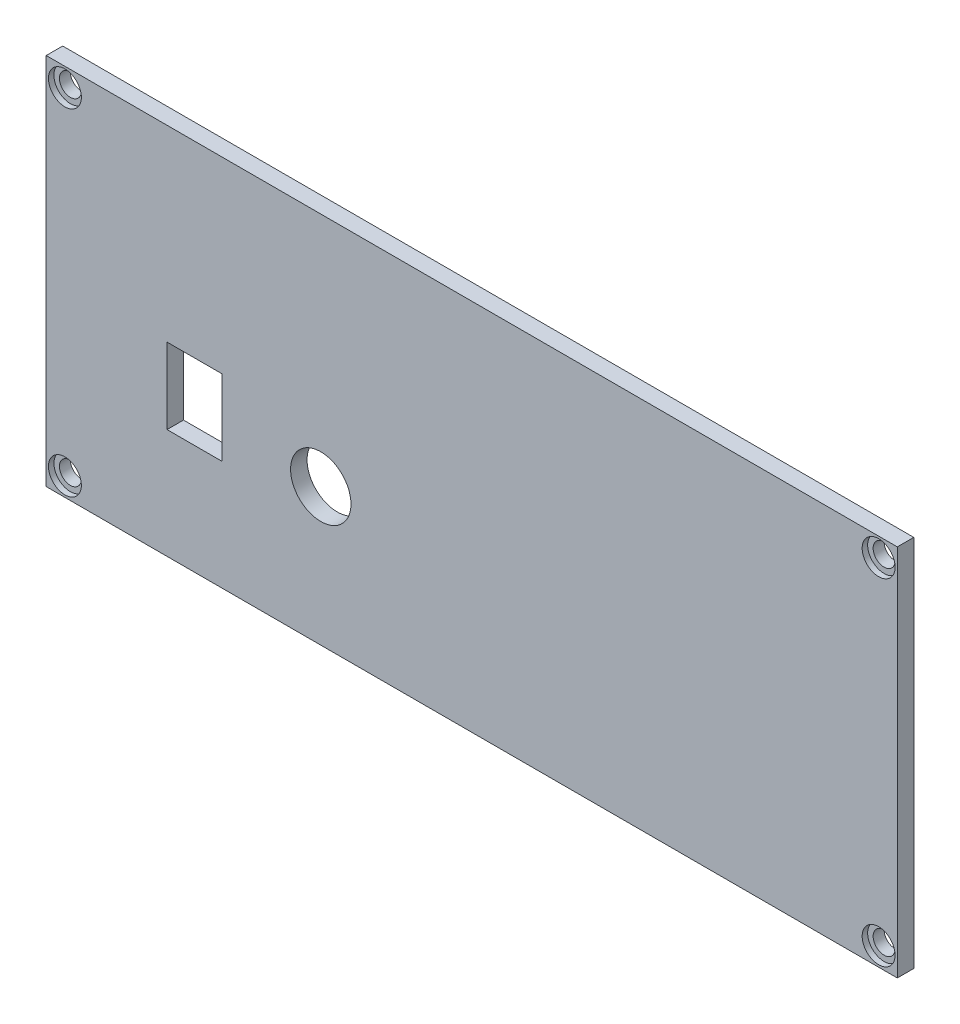
ISO-10303-21;
HEADER;
FILE_DESCRIPTION(('STEP AP214'),'2;1');
FILE_NAME('part.step','',(''),(''),'','','');
FILE_SCHEMA(('AUTOMOTIVE_DESIGN { 1 0 10303 214 1 1 1 1 }'));
ENDSEC;
DATA;
#1=APPLICATION_CONTEXT('core data for automotive mechanical design processes');
#2=APPLICATION_PROTOCOL_DEFINITION('international standard','automotive_design',2000,#1);
#3=PRODUCT_CONTEXT('',#1,'mechanical');
#4=PRODUCT('Part','Part','',(#3));
#5=PRODUCT_RELATED_PRODUCT_CATEGORY('part','',(#4));
#6=PRODUCT_DEFINITION_FORMATION('','',#4);
#7=PRODUCT_DEFINITION_CONTEXT('part definition',#1,'design');
#8=PRODUCT_DEFINITION('design','',#6,#7);
#9=PRODUCT_DEFINITION_SHAPE('','',#8);
#10=(LENGTH_UNIT() NAMED_UNIT(*) SI_UNIT(.MILLI.,.METRE.));
#11=(NAMED_UNIT(*) PLANE_ANGLE_UNIT() SI_UNIT($,.RADIAN.));
#12=(NAMED_UNIT(*) SI_UNIT($,.STERADIAN.) SOLID_ANGLE_UNIT());
#13=UNCERTAINTY_MEASURE_WITH_UNIT(LENGTH_MEASURE(1.E-05),#10,'distance_accuracy_value','');
#14=(GEOMETRIC_REPRESENTATION_CONTEXT(3) GLOBAL_UNCERTAINTY_ASSIGNED_CONTEXT((#13)) GLOBAL_UNIT_ASSIGNED_CONTEXT((#10,
#11,#12)) REPRESENTATION_CONTEXT('',''));
#15=CARTESIAN_POINT('',(0.,0.,0.));
#16=DIRECTION('',(0.,0.,1.));
#17=DIRECTION('',(1.,0.,0.));
#18=AXIS2_PLACEMENT_3D('',#15,#16,#17);
#19=CARTESIAN_POINT('',(-3.39999999999998,3.4,0.));
#20=DIRECTION('',(0.,0.,1.));
#21=DIRECTION('',(1.,0.,0.));
#22=AXIS2_PLACEMENT_3D('',#19,#20,#21);
#23=CYLINDRICAL_SURFACE('',#22,2.);
#24=CARTESIAN_POINT('',(-3.39999999999998,3.4,0.));
#25=DIRECTION('',(0.,0.,1.));
#26=DIRECTION('',(1.,0.,0.));
#27=AXIS2_PLACEMENT_3D('',#24,#25,#26);
#28=CIRCLE('',#27,2.);
#29=CARTESIAN_POINT('',(-1.39999999999998,3.4,0.));
#30=VERTEX_POINT('',#29);
#31=EDGE_CURVE('E169',#30,#30,#28,.T.);
#32=ORIENTED_EDGE('',*,*,#31,.F.);
#33=EDGE_LOOP('',(#32));
#34=FACE_BOUND('',#33,.T.);
#35=CARTESIAN_POINT('',(-3.39999999999998,3.4,2.));
#36=DIRECTION('',(0.,0.,1.));
#37=DIRECTION('',(1.,0.,0.));
#38=AXIS2_PLACEMENT_3D('',#35,#36,#37);
#39=CIRCLE('',#38,2.);
#40=CARTESIAN_POINT('',(-1.39999999999998,3.4,2.));
#41=VERTEX_POINT('',#40);
#42=EDGE_CURVE('E37',#41,#41,#39,.F.);
#43=ORIENTED_EDGE('',*,*,#42,.F.);
#44=EDGE_LOOP('',(#43));
#45=FACE_BOUND('',#44,.T.);
#46=ADVANCED_FACE('F33',(#34,#45),#23,.F.);
#47=CARTESIAN_POINT('',(-151.6,64.6,0.));
#48=DIRECTION('',(0.,0.,1.));
#49=DIRECTION('',(1.,0.,0.));
#50=AXIS2_PLACEMENT_3D('',#47,#48,#49);
#51=CYLINDRICAL_SURFACE('',#50,2.);
#52=CARTESIAN_POINT('',(-151.6,64.6,0.));
#53=DIRECTION('',(0.,0.,1.));
#54=DIRECTION('',(1.,0.,0.));
#55=AXIS2_PLACEMENT_3D('',#52,#53,#54);
#56=CIRCLE('',#55,2.);
#57=CARTESIAN_POINT('',(-149.6,64.6,0.));
#58=VERTEX_POINT('',#57);
#59=EDGE_CURVE('E193',#58,#58,#56,.T.);
#60=ORIENTED_EDGE('',*,*,#59,.F.);
#61=EDGE_LOOP('',(#60));
#62=FACE_BOUND('',#61,.T.);
#63=CARTESIAN_POINT('',(-151.6,64.6,2.));
#64=DIRECTION('',(0.,0.,1.));
#65=DIRECTION('',(1.,0.,0.));
#66=AXIS2_PLACEMENT_3D('',#63,#64,#65);
#67=CIRCLE('',#66,2.);
#68=CARTESIAN_POINT('',(-149.6,64.6,2.));
#69=VERTEX_POINT('',#68);
#70=EDGE_CURVE('E166',#69,#69,#67,.F.);
#71=ORIENTED_EDGE('',*,*,#70,.F.);
#72=EDGE_LOOP('',(#71));
#73=FACE_BOUND('',#72,.T.);
#74=ADVANCED_FACE('F243',(#62,#73),#51,.F.);
#75=CARTESIAN_POINT('',(0.,0.,3.));
#76=DIRECTION('',(-1.,0.,0.));
#77=DIRECTION('',(0.,-1.,0.));
#78=AXIS2_PLACEMENT_3D('',#75,#76,#77);
#79=PLANE('',#78);
#80=DIRECTION('',(0.,1.,0.));
#81=VECTOR('',#80,1.);
#82=CARTESIAN_POINT('',(0.,0.,0.));
#83=LINE('',#82,#81);
#84=CARTESIAN_POINT('',(0.,0.,0.));
#85=VERTEX_POINT('',#84);
#86=CARTESIAN_POINT('',(0.,68.,0.));
#87=VERTEX_POINT('',#86);
#88=EDGE_CURVE('E137',#85,#87,#83,.T.);
#89=ORIENTED_EDGE('',*,*,#88,.T.);
#90=DIRECTION('',(0.,0.,-1.));
#91=VECTOR('',#90,1.);
#92=CARTESIAN_POINT('',(0.,68.,3.));
#93=LINE('',#92,#91);
#94=CARTESIAN_POINT('',(0.,68.,3.));
#95=VERTEX_POINT('',#94);
#96=EDGE_CURVE('E11',#95,#87,#93,.T.);
#97=ORIENTED_EDGE('',*,*,#96,.F.);
#98=DIRECTION('',(0.,1.,0.));
#99=VECTOR('',#98,1.);
#100=CARTESIAN_POINT('',(0.,0.,3.));
#101=LINE('',#100,#99);
#102=CARTESIAN_POINT('',(0.,0.,3.));
#103=VERTEX_POINT('',#102);
#104=EDGE_CURVE('E141',#103,#95,#101,.T.);
#105=ORIENTED_EDGE('',*,*,#104,.F.);
#106=DIRECTION('',(0.,0.,-1.));
#107=VECTOR('',#106,1.);
#108=CARTESIAN_POINT('',(0.,0.,3.));
#109=LINE('',#108,#107);
#110=EDGE_CURVE('E151',#103,#85,#109,.T.);
#111=ORIENTED_EDGE('',*,*,#110,.T.);
#112=EDGE_LOOP('',(#89,#97,#105,#111));
#113=FACE_BOUND('',#112,.T.);
#114=ADVANCED_FACE('F35',(#113),#79,.F.);
#115=CARTESIAN_POINT('',(0.,68.,3.));
#116=DIRECTION('',(0.,-1.,0.));
#117=DIRECTION('',(1.,0.,0.));
#118=AXIS2_PLACEMENT_3D('',#115,#116,#117);
#119=PLANE('',#118);
#120=DIRECTION('',(-1.,0.,0.));
#121=VECTOR('',#120,1.);
#122=CARTESIAN_POINT('',(0.,68.,0.));
#123=LINE('',#122,#121);
#124=CARTESIAN_POINT('',(-155.,68.,0.));
#125=VERTEX_POINT('',#124);
#126=EDGE_CURVE('E154',#87,#125,#123,.T.);
#127=ORIENTED_EDGE('',*,*,#126,.T.);
#128=DIRECTION('',(0.,0.,-1.));
#129=VECTOR('',#128,1.);
#130=CARTESIAN_POINT('',(-155.,68.,3.));
#131=LINE('',#130,#129);
#132=CARTESIAN_POINT('',(-155.,68.,3.));
#133=VERTEX_POINT('',#132);
#134=EDGE_CURVE('E42',#133,#125,#131,.T.);
#135=ORIENTED_EDGE('',*,*,#134,.F.);
#136=DIRECTION('',(-1.,0.,0.));
#137=VECTOR('',#136,1.);
#138=CARTESIAN_POINT('',(0.,68.,3.));
#139=LINE('',#138,#137);
#140=EDGE_CURVE('E144',#95,#133,#139,.T.);
#141=ORIENTED_EDGE('',*,*,#140,.F.);
#142=ORIENTED_EDGE('',*,*,#96,.T.);
#143=EDGE_LOOP('',(#127,#135,#141,#142));
#144=FACE_BOUND('',#143,.T.);
#145=ADVANCED_FACE('F224',(#144),#119,.F.);
#146=CARTESIAN_POINT('',(-155.,0.,3.));
#147=DIRECTION('',(1.,0.,0.));
#148=DIRECTION('',(0.,0.,-1.));
#149=AXIS2_PLACEMENT_3D('',#146,#147,#148);
#150=PLANE('',#149);
#151=DIRECTION('',(0.,-1.,0.));
#152=VECTOR('',#151,1.);
#153=CARTESIAN_POINT('',(-155.,0.,0.));
#154=LINE('',#153,#152);
#155=CARTESIAN_POINT('',(-155.,0.,0.));
#156=VERTEX_POINT('',#155);
#157=EDGE_CURVE('E156',#125,#156,#154,.T.);
#158=ORIENTED_EDGE('',*,*,#157,.T.);
#159=DIRECTION('',(0.,0.,-1.));
#160=VECTOR('',#159,1.);
#161=CARTESIAN_POINT('',(-155.,0.,3.));
#162=LINE('',#161,#160);
#163=CARTESIAN_POINT('',(-155.,0.,3.));
#164=VERTEX_POINT('',#163);
#165=EDGE_CURVE('E161',#164,#156,#162,.T.);
#166=ORIENTED_EDGE('',*,*,#165,.F.);
#167=DIRECTION('',(0.,-1.,0.));
#168=VECTOR('',#167,1.);
#169=CARTESIAN_POINT('',(-155.,0.,3.));
#170=LINE('',#169,#168);
#171=EDGE_CURVE('E147',#133,#164,#170,.T.);
#172=ORIENTED_EDGE('',*,*,#171,.F.);
#173=ORIENTED_EDGE('',*,*,#134,.T.);
#174=EDGE_LOOP('',(#158,#166,#172,#173));
#175=FACE_BOUND('',#174,.T.);
#176=ADVANCED_FACE('F229',(#175),#150,.F.);
#177=CARTESIAN_POINT('',(0.,0.,3.));
#178=DIRECTION('',(0.,1.,0.));
#179=DIRECTION('',(0.,0.,1.));
#180=AXIS2_PLACEMENT_3D('',#177,#178,#179);
#181=PLANE('',#180);
#182=DIRECTION('',(1.,0.,0.));
#183=VECTOR('',#182,1.);
#184=CARTESIAN_POINT('',(0.,0.,0.));
#185=LINE('',#184,#183);
#186=EDGE_CURVE('E145',#156,#85,#185,.T.);
#187=ORIENTED_EDGE('',*,*,#186,.T.);
#188=ORIENTED_EDGE('',*,*,#110,.F.);
#189=DIRECTION('',(1.,0.,0.));
#190=VECTOR('',#189,1.);
#191=CARTESIAN_POINT('',(0.,0.,3.));
#192=LINE('',#191,#190);
#193=EDGE_CURVE('E149',#164,#103,#192,.T.);
#194=ORIENTED_EDGE('',*,*,#193,.F.);
#195=ORIENTED_EDGE('',*,*,#165,.T.);
#196=EDGE_LOOP('',(#187,#188,#194,#195));
#197=FACE_BOUND('',#196,.T.);
#198=ADVANCED_FACE('F211',(#197),#181,.F.);
#199=CARTESIAN_POINT('',(0.,0.,3.));
#200=DIRECTION('',(0.,0.,1.));
#201=DIRECTION('',(1.,0.,0.));
#202=AXIS2_PLACEMENT_3D('',#199,#200,#201);
#203=PLANE('',#202);
#204=CARTESIAN_POINT('',(-3.39999999999999,64.6,3.));
#205=DIRECTION('',(0.,0.,1.));
#206=DIRECTION('',(-1.,0.,0.));
#207=AXIS2_PLACEMENT_3D('',#204,#205,#206);
#208=CIRCLE('',#207,2.99999999999999);
#209=CARTESIAN_POINT('',(-6.39999999999998,64.6,3.));
#210=VERTEX_POINT('',#209);
#211=EDGE_CURVE('E452',#210,#210,#208,.T.);
#212=ORIENTED_EDGE('',*,*,#211,.F.);
#213=EDGE_LOOP('',(#212));
#214=FACE_BOUND('',#213,.T.);
#215=CARTESIAN_POINT('',(-3.39999999999999,3.4,3.));
#216=DIRECTION('',(0.,0.,1.));
#217=DIRECTION('',(1.,0.,0.));
#218=AXIS2_PLACEMENT_3D('',#215,#216,#217);
#219=CIRCLE('',#218,2.99999999999999);
#220=CARTESIAN_POINT('',(-0.399999999999992,3.4,3.));
#221=VERTEX_POINT('',#220);
#222=EDGE_CURVE('E448',#221,#221,#219,.T.);
#223=ORIENTED_EDGE('',*,*,#222,.F.);
#224=EDGE_LOOP('',(#223));
#225=FACE_BOUND('',#224,.T.);
#226=CARTESIAN_POINT('',(-151.6,3.39999999999997,3.));
#227=DIRECTION('',(0.,0.,1.));
#228=DIRECTION('',(-1.,0.,0.));
#229=AXIS2_PLACEMENT_3D('',#226,#227,#228);
#230=CIRCLE('',#229,2.99999999999999);
#231=CARTESIAN_POINT('',(-154.6,3.39999999999997,3.));
#232=VERTEX_POINT('',#231);
#233=EDGE_CURVE('E455',#232,#232,#230,.T.);
#234=ORIENTED_EDGE('',*,*,#233,.F.);
#235=EDGE_LOOP('',(#234));
#236=FACE_BOUND('',#235,.T.);
#237=CARTESIAN_POINT('',(-151.6,64.6,3.));
#238=DIRECTION('',(0.,0.,1.));
#239=DIRECTION('',(1.,0.,0.));
#240=AXIS2_PLACEMENT_3D('',#237,#238,#239);
#241=CIRCLE('',#240,2.99999999999999);
#242=CARTESIAN_POINT('',(-148.6,64.6,3.));
#243=VERTEX_POINT('',#242);
#244=EDGE_CURVE('E179',#243,#243,#241,.T.);
#245=ORIENTED_EDGE('',*,*,#244,.F.);
#246=EDGE_LOOP('',(#245));
#247=FACE_BOUND('',#246,.T.);
#248=CARTESIAN_POINT('',(-105.,25.,3.));
#249=DIRECTION('',(0.,0.,1.));
#250=DIRECTION('',(1.,0.,0.));
#251=AXIS2_PLACEMENT_3D('',#248,#249,#250);
#252=CIRCLE('',#251,5.5);
#253=CARTESIAN_POINT('',(-99.5,25.,3.));
#254=VERTEX_POINT('',#253);
#255=EDGE_CURVE('E124',#254,#254,#252,.T.);
#256=ORIENTED_EDGE('',*,*,#255,.F.);
#257=EDGE_LOOP('',(#256));
#258=FACE_BOUND('',#257,.T.);
#259=DIRECTION('',(0.,-1.,0.));
#260=VECTOR('',#259,1.);
#261=CARTESIAN_POINT('',(-133.,33.8,3.));
#262=LINE('',#261,#260);
#263=CARTESIAN_POINT('',(-133.,33.8,3.));
#264=VERTEX_POINT('',#263);
#265=CARTESIAN_POINT('',(-133.,20.,3.));
#266=VERTEX_POINT('',#265);
#267=EDGE_CURVE('E50',#264,#266,#262,.T.);
#268=ORIENTED_EDGE('',*,*,#267,.F.);
#269=DIRECTION('',(-1.,0.,0.));
#270=VECTOR('',#269,1.);
#271=CARTESIAN_POINT('',(-133.,33.8,3.));
#272=LINE('',#271,#270);
#273=CARTESIAN_POINT('',(-123.,33.8,3.));
#274=VERTEX_POINT('',#273);
#275=EDGE_CURVE('E118',#274,#264,#272,.T.);
#276=ORIENTED_EDGE('',*,*,#275,.F.);
#277=DIRECTION('',(0.,1.,0.));
#278=VECTOR('',#277,1.);
#279=CARTESIAN_POINT('',(-123.,33.8,3.));
#280=LINE('',#279,#278);
#281=CARTESIAN_POINT('',(-123.,20.,3.));
#282=VERTEX_POINT('',#281);
#283=EDGE_CURVE('E121',#282,#274,#280,.T.);
#284=ORIENTED_EDGE('',*,*,#283,.F.);
#285=DIRECTION('',(1.,0.,0.));
#286=VECTOR('',#285,1.);
#287=CARTESIAN_POINT('',(-133.,20.,3.));
#288=LINE('',#287,#286);
#289=EDGE_CURVE('E130',#266,#282,#288,.T.);
#290=ORIENTED_EDGE('',*,*,#289,.F.);
#291=EDGE_LOOP('',(#268,#276,#284,#290));
#292=FACE_BOUND('',#291,.T.);
#293=ORIENTED_EDGE('',*,*,#104,.T.);
#294=ORIENTED_EDGE('',*,*,#140,.T.);
#295=ORIENTED_EDGE('',*,*,#171,.T.);
#296=ORIENTED_EDGE('',*,*,#193,.T.);
#297=EDGE_LOOP('',(#293,#294,#295,#296));
#298=FACE_BOUND('',#297,.T.);
#299=ADVANCED_FACE('F208',(#214,#225,#236,#247,#258,#292,#298),#203,.T.);
#300=CARTESIAN_POINT('',(0.,0.,0.));
#301=DIRECTION('',(0.,0.,1.));
#302=DIRECTION('',(1.,0.,0.));
#303=AXIS2_PLACEMENT_3D('',#300,#301,#302);
#304=PLANE('',#303);
#305=CARTESIAN_POINT('',(-3.39999999999999,64.6,0.));
#306=DIRECTION('',(0.,0.,1.));
#307=DIRECTION('',(-1.,0.,0.));
#308=AXIS2_PLACEMENT_3D('',#305,#306,#307);
#309=CIRCLE('',#308,2.);
#310=CARTESIAN_POINT('',(-5.39999999999998,64.6,0.));
#311=VERTEX_POINT('',#310);
#312=EDGE_CURVE('E190',#311,#311,#309,.T.);
#313=ORIENTED_EDGE('',*,*,#312,.T.);
#314=EDGE_LOOP('',(#313));
#315=FACE_BOUND('',#314,.T.);
#316=CARTESIAN_POINT('',(-151.6,3.39999999999997,0.));
#317=DIRECTION('',(0.,0.,1.));
#318=DIRECTION('',(-1.,0.,0.));
#319=AXIS2_PLACEMENT_3D('',#316,#317,#318);
#320=CIRCLE('',#319,2.);
#321=CARTESIAN_POINT('',(-153.6,3.39999999999997,0.));
#322=VERTEX_POINT('',#321);
#323=EDGE_CURVE('E194',#322,#322,#320,.T.);
#324=ORIENTED_EDGE('',*,*,#323,.T.);
#325=EDGE_LOOP('',(#324));
#326=FACE_BOUND('',#325,.T.);
#327=ORIENTED_EDGE('',*,*,#31,.T.);
#328=EDGE_LOOP('',(#327));
#329=FACE_BOUND('',#328,.T.);
#330=ORIENTED_EDGE('',*,*,#59,.T.);
#331=EDGE_LOOP('',(#330));
#332=FACE_BOUND('',#331,.T.);
#333=CARTESIAN_POINT('',(-105.,25.,0.));
#334=DIRECTION('',(0.,0.,1.));
#335=DIRECTION('',(1.,0.,0.));
#336=AXIS2_PLACEMENT_3D('',#333,#334,#335);
#337=CIRCLE('',#336,5.5);
#338=CARTESIAN_POINT('',(-99.5,25.,0.));
#339=VERTEX_POINT('',#338);
#340=EDGE_CURVE('E131',#339,#339,#337,.T.);
#341=ORIENTED_EDGE('',*,*,#340,.T.);
#342=EDGE_LOOP('',(#341));
#343=FACE_BOUND('',#342,.T.);
#344=DIRECTION('',(-1.,0.,0.));
#345=VECTOR('',#344,1.);
#346=CARTESIAN_POINT('',(-133.,33.8,0.));
#347=LINE('',#346,#345);
#348=CARTESIAN_POINT('',(-123.,33.8,0.));
#349=VERTEX_POINT('',#348);
#350=CARTESIAN_POINT('',(-133.,33.8,0.));
#351=VERTEX_POINT('',#350);
#352=EDGE_CURVE('E108',#349,#351,#347,.T.);
#353=ORIENTED_EDGE('',*,*,#352,.T.);
#354=DIRECTION('',(0.,-1.,0.));
#355=VECTOR('',#354,1.);
#356=CARTESIAN_POINT('',(-133.,33.8,0.));
#357=LINE('',#356,#355);
#358=CARTESIAN_POINT('',(-133.,20.,0.));
#359=VERTEX_POINT('',#358);
#360=EDGE_CURVE('E102',#351,#359,#357,.T.);
#361=ORIENTED_EDGE('',*,*,#360,.T.);
#362=DIRECTION('',(1.,0.,0.));
#363=VECTOR('',#362,1.);
#364=CARTESIAN_POINT('',(-133.,20.,0.));
#365=LINE('',#364,#363);
#366=CARTESIAN_POINT('',(-123.,20.,0.));
#367=VERTEX_POINT('',#366);
#368=EDGE_CURVE('E111',#359,#367,#365,.T.);
#369=ORIENTED_EDGE('',*,*,#368,.T.);
#370=DIRECTION('',(0.,1.,0.));
#371=VECTOR('',#370,1.);
#372=CARTESIAN_POINT('',(-123.,33.8,0.));
#373=LINE('',#372,#371);
#374=EDGE_CURVE('E58',#367,#349,#373,.T.);
#375=ORIENTED_EDGE('',*,*,#374,.T.);
#376=EDGE_LOOP('',(#353,#361,#369,#375));
#377=FACE_BOUND('',#376,.T.);
#378=ORIENTED_EDGE('',*,*,#88,.F.);
#379=ORIENTED_EDGE('',*,*,#186,.F.);
#380=ORIENTED_EDGE('',*,*,#157,.F.);
#381=ORIENTED_EDGE('',*,*,#126,.F.);
#382=EDGE_LOOP('',(#378,#379,#380,#381));
#383=FACE_BOUND('',#382,.T.);
#384=ADVANCED_FACE('F115',(#315,#326,#329,#332,#343,#377,#383),#304,.F.);
#385=CARTESIAN_POINT('',(-133.,33.8,0.));
#386=DIRECTION('',(-1.,0.,0.));
#387=DIRECTION('',(0.,0.,1.));
#388=AXIS2_PLACEMENT_3D('',#385,#386,#387);
#389=PLANE('',#388);
#390=ORIENTED_EDGE('',*,*,#267,.T.);
#391=DIRECTION('',(0.,0.,1.));
#392=VECTOR('',#391,1.);
#393=CARTESIAN_POINT('',(-133.,20.,0.));
#394=LINE('',#393,#392);
#395=EDGE_CURVE('E98',#359,#266,#394,.T.);
#396=ORIENTED_EDGE('',*,*,#395,.F.);
#397=ORIENTED_EDGE('',*,*,#360,.F.);
#398=DIRECTION('',(0.,0.,1.));
#399=VECTOR('',#398,1.);
#400=CARTESIAN_POINT('',(-133.,33.8,0.));
#401=LINE('',#400,#399);
#402=EDGE_CURVE('E135',#351,#264,#401,.T.);
#403=ORIENTED_EDGE('',*,*,#402,.T.);
#404=EDGE_LOOP('',(#390,#396,#397,#403));
#405=FACE_BOUND('',#404,.T.);
#406=ADVANCED_FACE('F100',(#405),#389,.F.);
#407=CARTESIAN_POINT('',(-133.,33.8,0.));
#408=DIRECTION('',(0.,1.,0.));
#409=DIRECTION('',(-1.,0.,0.));
#410=AXIS2_PLACEMENT_3D('',#407,#408,#409);
#411=PLANE('',#410);
#412=ORIENTED_EDGE('',*,*,#275,.T.);
#413=ORIENTED_EDGE('',*,*,#402,.F.);
#414=ORIENTED_EDGE('',*,*,#352,.F.);
#415=DIRECTION('',(0.,0.,1.));
#416=VECTOR('',#415,1.);
#417=CARTESIAN_POINT('',(-123.,33.8,0.));
#418=LINE('',#417,#416);
#419=EDGE_CURVE('E138',#349,#274,#418,.T.);
#420=ORIENTED_EDGE('',*,*,#419,.T.);
#421=EDGE_LOOP('',(#412,#413,#414,#420));
#422=FACE_BOUND('',#421,.T.);
#423=ADVANCED_FACE('F238',(#422),#411,.F.);
#424=CARTESIAN_POINT('',(-123.,33.8,0.));
#425=DIRECTION('',(1.,0.,0.));
#426=DIRECTION('',(0.,0.,-1.));
#427=AXIS2_PLACEMENT_3D('',#424,#425,#426);
#428=PLANE('',#427);
#429=ORIENTED_EDGE('',*,*,#283,.T.);
#430=ORIENTED_EDGE('',*,*,#419,.F.);
#431=ORIENTED_EDGE('',*,*,#374,.F.);
#432=DIRECTION('',(0.,0.,1.));
#433=VECTOR('',#432,1.);
#434=CARTESIAN_POINT('',(-123.,20.,0.));
#435=LINE('',#434,#433);
#436=EDGE_CURVE('E107',#367,#282,#435,.T.);
#437=ORIENTED_EDGE('',*,*,#436,.T.);
#438=EDGE_LOOP('',(#429,#430,#431,#437));
#439=FACE_BOUND('',#438,.T.);
#440=ADVANCED_FACE('F262',(#439),#428,.F.);
#441=CARTESIAN_POINT('',(-133.,20.,0.));
#442=DIRECTION('',(0.,-1.,0.));
#443=DIRECTION('',(0.,0.,-1.));
#444=AXIS2_PLACEMENT_3D('',#441,#442,#443);
#445=PLANE('',#444);
#446=ORIENTED_EDGE('',*,*,#289,.T.);
#447=ORIENTED_EDGE('',*,*,#436,.F.);
#448=ORIENTED_EDGE('',*,*,#368,.F.);
#449=ORIENTED_EDGE('',*,*,#395,.T.);
#450=EDGE_LOOP('',(#446,#447,#448,#449));
#451=FACE_BOUND('',#450,.T.);
#452=ADVANCED_FACE('F112',(#451),#445,.F.);
#453=CARTESIAN_POINT('',(-105.,25.,0.));
#454=DIRECTION('',(0.,0.,1.));
#455=DIRECTION('',(1.,0.,0.));
#456=AXIS2_PLACEMENT_3D('',#453,#454,#455);
#457=CYLINDRICAL_SURFACE('',#456,5.5);
#458=ORIENTED_EDGE('',*,*,#340,.F.);
#459=EDGE_LOOP('',(#458));
#460=FACE_BOUND('',#459,.T.);
#461=ORIENTED_EDGE('',*,*,#255,.T.);
#462=EDGE_LOOP('',(#461));
#463=FACE_BOUND('',#462,.T.);
#464=ADVANCED_FACE('F206',(#460,#463),#457,.F.);
#465=CARTESIAN_POINT('',(-151.6,3.39999999999997,0.));
#466=DIRECTION('',(0.,0.,1.));
#467=DIRECTION('',(1.,0.,0.));
#468=AXIS2_PLACEMENT_3D('',#465,#466,#467);
#469=CYLINDRICAL_SURFACE('',#468,2.);
#470=CARTESIAN_POINT('',(-151.6,3.39999999999997,2.));
#471=DIRECTION('',(0.,0.,-1.));
#472=DIRECTION('',(-1.,0.,0.));
#473=AXIS2_PLACEMENT_3D('',#470,#471,#472);
#474=CIRCLE('',#473,2.);
#475=CARTESIAN_POINT('',(-153.6,3.39999999999997,2.));
#476=VERTEX_POINT('',#475);
#477=EDGE_CURVE('E173',#476,#476,#474,.F.);
#478=ORIENTED_EDGE('',*,*,#477,.T.);
#479=EDGE_LOOP('',(#478));
#480=FACE_BOUND('',#479,.T.);
#481=ORIENTED_EDGE('',*,*,#323,.F.);
#482=EDGE_LOOP('',(#481));
#483=FACE_BOUND('',#482,.T.);
#484=ADVANCED_FACE('F254',(#480,#483),#469,.F.);
#485=CARTESIAN_POINT('',(-3.39999999999999,64.6,0.));
#486=DIRECTION('',(0.,0.,1.));
#487=DIRECTION('',(1.,0.,0.));
#488=AXIS2_PLACEMENT_3D('',#485,#486,#487);
#489=CYLINDRICAL_SURFACE('',#488,2.);
#490=CARTESIAN_POINT('',(-3.39999999999999,64.6,2.));
#491=DIRECTION('',(0.,0.,-1.));
#492=DIRECTION('',(-1.,0.,0.));
#493=AXIS2_PLACEMENT_3D('',#490,#491,#492);
#494=CIRCLE('',#493,2.);
#495=CARTESIAN_POINT('',(-5.39999999999998,64.6,2.));
#496=VERTEX_POINT('',#495);
#497=EDGE_CURVE('E171',#496,#496,#494,.F.);
#498=ORIENTED_EDGE('',*,*,#497,.T.);
#499=EDGE_LOOP('',(#498));
#500=FACE_BOUND('',#499,.T.);
#501=ORIENTED_EDGE('',*,*,#312,.F.);
#502=EDGE_LOOP('',(#501));
#503=FACE_BOUND('',#502,.T.);
#504=ADVANCED_FACE('F281',(#500,#503),#489,.F.);
#505=CARTESIAN_POINT('',(-151.6,64.6,2.));
#506=DIRECTION('',(0.,0.,1.));
#507=DIRECTION('',(1.,0.,0.));
#508=AXIS2_PLACEMENT_3D('',#505,#506,#507);
#509=PLANE('',#508);
#510=CARTESIAN_POINT('',(-151.6,64.6,2.));
#511=DIRECTION('',(0.,0.,1.));
#512=DIRECTION('',(1.,0.,0.));
#513=AXIS2_PLACEMENT_3D('',#510,#511,#512);
#514=CIRCLE('',#513,2.99999999999999);
#515=CARTESIAN_POINT('',(-148.6,64.6,2.));
#516=VERTEX_POINT('',#515);
#517=EDGE_CURVE('E170',#516,#516,#514,.T.);
#518=ORIENTED_EDGE('',*,*,#517,.T.);
#519=EDGE_LOOP('',(#518));
#520=FACE_BOUND('',#519,.T.);
#521=ORIENTED_EDGE('',*,*,#70,.T.);
#522=EDGE_LOOP('',(#521));
#523=FACE_BOUND('',#522,.T.);
#524=ADVANCED_FACE('F288',(#520,#523),#509,.T.);
#525=CARTESIAN_POINT('',(-151.6,64.6,2.));
#526=DIRECTION('',(0.,0.,1.));
#527=DIRECTION('',(1.,0.,0.));
#528=AXIS2_PLACEMENT_3D('',#525,#526,#527);
#529=CYLINDRICAL_SURFACE('',#528,2.99999999999999);
#530=ORIENTED_EDGE('',*,*,#517,.F.);
#531=EDGE_LOOP('',(#530));
#532=FACE_BOUND('',#531,.T.);
#533=ORIENTED_EDGE('',*,*,#244,.T.);
#534=EDGE_LOOP('',(#533));
#535=FACE_BOUND('',#534,.T.);
#536=ADVANCED_FACE('F295',(#532,#535),#529,.F.);
#537=CARTESIAN_POINT('',(-3.39999999999999,64.6,2.));
#538=DIRECTION('',(0.,0.,-1.));
#539=DIRECTION('',(-1.,0.,0.));
#540=AXIS2_PLACEMENT_3D('',#537,#538,#539);
#541=PLANE('',#540);
#542=CARTESIAN_POINT('',(-3.39999999999999,64.6,2.));
#543=DIRECTION('',(0.,0.,1.));
#544=DIRECTION('',(-1.,0.,0.));
#545=AXIS2_PLACEMENT_3D('',#542,#543,#544);
#546=CIRCLE('',#545,2.99999999999999);
#547=CARTESIAN_POINT('',(-6.39999999999998,64.6,2.));
#548=VERTEX_POINT('',#547);
#549=EDGE_CURVE('E174',#548,#548,#546,.T.);
#550=ORIENTED_EDGE('',*,*,#549,.T.);
#551=EDGE_LOOP('',(#550));
#552=FACE_BOUND('',#551,.T.);
#553=ORIENTED_EDGE('',*,*,#497,.F.);
#554=EDGE_LOOP('',(#553));
#555=FACE_BOUND('',#554,.T.);
#556=ADVANCED_FACE('F303',(#552,#555),#541,.F.);
#557=CARTESIAN_POINT('',(-3.39999999999999,64.6,2.));
#558=DIRECTION('',(0.,0.,1.));
#559=DIRECTION('',(1.,0.,0.));
#560=AXIS2_PLACEMENT_3D('',#557,#558,#559);
#561=CYLINDRICAL_SURFACE('',#560,2.99999999999999);
#562=ORIENTED_EDGE('',*,*,#549,.F.);
#563=EDGE_LOOP('',(#562));
#564=FACE_BOUND('',#563,.T.);
#565=ORIENTED_EDGE('',*,*,#211,.T.);
#566=EDGE_LOOP('',(#565));
#567=FACE_BOUND('',#566,.T.);
#568=ADVANCED_FACE('F311',(#564,#567),#561,.F.);
#569=CARTESIAN_POINT('',(-151.6,3.39999999999997,2.));
#570=DIRECTION('',(0.,0.,-1.));
#571=DIRECTION('',(-1.,0.,0.));
#572=AXIS2_PLACEMENT_3D('',#569,#570,#571);
#573=PLANE('',#572);
#574=CARTESIAN_POINT('',(-151.6,3.39999999999997,2.));
#575=DIRECTION('',(0.,0.,1.));
#576=DIRECTION('',(-1.,0.,0.));
#577=AXIS2_PLACEMENT_3D('',#574,#575,#576);
#578=CIRCLE('',#577,2.99999999999999);
#579=CARTESIAN_POINT('',(-154.6,3.39999999999997,2.));
#580=VERTEX_POINT('',#579);
#581=EDGE_CURVE('E450',#580,#580,#578,.T.);
#582=ORIENTED_EDGE('',*,*,#581,.T.);
#583=EDGE_LOOP('',(#582));
#584=FACE_BOUND('',#583,.T.);
#585=ORIENTED_EDGE('',*,*,#477,.F.);
#586=EDGE_LOOP('',(#585));
#587=FACE_BOUND('',#586,.T.);
#588=ADVANCED_FACE('F319',(#584,#587),#573,.F.);
#589=CARTESIAN_POINT('',(-151.6,3.39999999999997,2.));
#590=DIRECTION('',(0.,0.,1.));
#591=DIRECTION('',(1.,0.,0.));
#592=AXIS2_PLACEMENT_3D('',#589,#590,#591);
#593=CYLINDRICAL_SURFACE('',#592,2.99999999999999);
#594=ORIENTED_EDGE('',*,*,#581,.F.);
#595=EDGE_LOOP('',(#594));
#596=FACE_BOUND('',#595,.T.);
#597=ORIENTED_EDGE('',*,*,#233,.T.);
#598=EDGE_LOOP('',(#597));
#599=FACE_BOUND('',#598,.T.);
#600=ADVANCED_FACE('F327',(#596,#599),#593,.F.);
#601=CARTESIAN_POINT('',(-3.39999999999999,3.4,2.));
#602=DIRECTION('',(0.,0.,1.));
#603=DIRECTION('',(1.,0.,0.));
#604=AXIS2_PLACEMENT_3D('',#601,#602,#603);
#605=PLANE('',#604);
#606=CARTESIAN_POINT('',(-3.39999999999999,3.4,2.));
#607=DIRECTION('',(0.,0.,1.));
#608=DIRECTION('',(1.,0.,0.));
#609=AXIS2_PLACEMENT_3D('',#606,#607,#608);
#610=CIRCLE('',#609,2.99999999999999);
#611=CARTESIAN_POINT('',(-0.399999999999992,3.4,2.));
#612=VERTEX_POINT('',#611);
#613=EDGE_CURVE('E445',#612,#612,#610,.T.);
#614=ORIENTED_EDGE('',*,*,#613,.T.);
#615=EDGE_LOOP('',(#614));
#616=FACE_BOUND('',#615,.T.);
#617=ORIENTED_EDGE('',*,*,#42,.T.);
#618=EDGE_LOOP('',(#617));
#619=FACE_BOUND('',#618,.T.);
#620=ADVANCED_FACE('F335',(#616,#619),#605,.T.);
#621=CARTESIAN_POINT('',(-3.39999999999999,3.4,2.));
#622=DIRECTION('',(0.,0.,1.));
#623=DIRECTION('',(1.,0.,0.));
#624=AXIS2_PLACEMENT_3D('',#621,#622,#623);
#625=CYLINDRICAL_SURFACE('',#624,2.99999999999999);
#626=ORIENTED_EDGE('',*,*,#613,.F.);
#627=EDGE_LOOP('',(#626));
#628=FACE_BOUND('',#627,.T.);
#629=ORIENTED_EDGE('',*,*,#222,.T.);
#630=EDGE_LOOP('',(#629));
#631=FACE_BOUND('',#630,.T.);
#632=ADVANCED_FACE('F343',(#628,#631),#625,.F.);
#633=CLOSED_SHELL('',(#46,#74,#114,#145,#176,#198,#299,#384,#406,#423,#440,#452,#464,#484,#504,
#524,#536,#556,#568,#588,#600,#620,#632));
#634=MANIFOLD_SOLID_BREP('B2',#633);
#635=ADVANCED_BREP_SHAPE_REPRESENTATION('',(#18,#634),#14);
#636=SHAPE_DEFINITION_REPRESENTATION(#9,#635);
ENDSEC;
END-ISO-10303-21;
